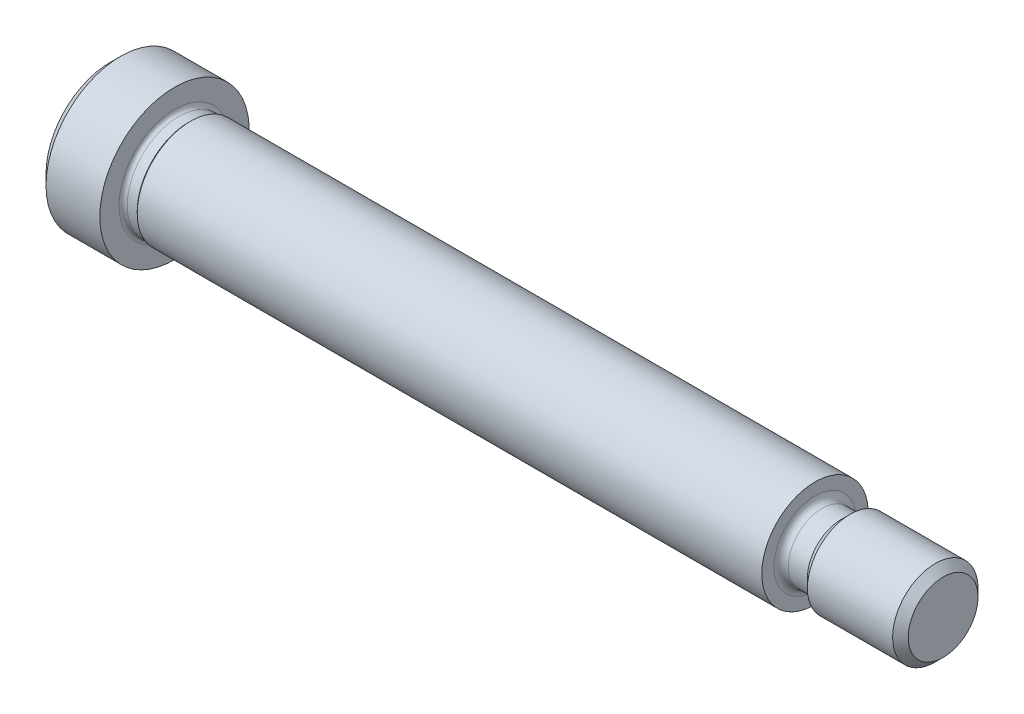
ISO-10303-21;
HEADER;
FILE_DESCRIPTION(('STEP AP214'),'2;1');
FILE_NAME('part.step','',(''),(''),'','','');
FILE_SCHEMA(('AUTOMOTIVE_DESIGN { 1 0 10303 214 1 1 1 1 }'));
ENDSEC;
DATA;
#1=APPLICATION_CONTEXT('core data for automotive mechanical design processes');
#2=APPLICATION_PROTOCOL_DEFINITION('international standard','automotive_design',2000,#1);
#3=PRODUCT_CONTEXT('',#1,'mechanical');
#4=PRODUCT('Part','Part','',(#3));
#5=PRODUCT_RELATED_PRODUCT_CATEGORY('part','',(#4));
#6=PRODUCT_DEFINITION_FORMATION('','',#4);
#7=PRODUCT_DEFINITION_CONTEXT('part definition',#1,'design');
#8=PRODUCT_DEFINITION('design','',#6,#7);
#9=PRODUCT_DEFINITION_SHAPE('','',#8);
#10=(LENGTH_UNIT() NAMED_UNIT(*) SI_UNIT(.MILLI.,.METRE.));
#11=(NAMED_UNIT(*) PLANE_ANGLE_UNIT() SI_UNIT($,.RADIAN.));
#12=(NAMED_UNIT(*) SI_UNIT($,.STERADIAN.) SOLID_ANGLE_UNIT());
#13=UNCERTAINTY_MEASURE_WITH_UNIT(LENGTH_MEASURE(1.E-05),#10,'distance_accuracy_value','');
#14=(GEOMETRIC_REPRESENTATION_CONTEXT(3) GLOBAL_UNCERTAINTY_ASSIGNED_CONTEXT((#13)) GLOBAL_UNIT_ASSIGNED_CONTEXT((#10,
#11,#12)) REPRESENTATION_CONTEXT('',''));
#15=CARTESIAN_POINT('',(0.,0.,0.));
#16=DIRECTION('',(0.,0.,1.));
#17=DIRECTION('',(1.,0.,0.));
#18=AXIS2_PLACEMENT_3D('',#15,#16,#17);
#19=CARTESIAN_POINT('',(0.,0.,0.));
#20=DIRECTION('',(-1.,0.,0.));
#21=DIRECTION('',(0.,0.,1.));
#22=AXIS2_PLACEMENT_3D('',#19,#20,#21);
#23=PLANE('',#22);
#24=CARTESIAN_POINT('',(0.,0.,0.));
#25=DIRECTION('',(-1.,0.,0.));
#26=DIRECTION('',(0.,0.,1.));
#27=AXIS2_PLACEMENT_3D('',#24,#25,#26);
#28=CIRCLE('',#27,9.58849999999999);
#29=CARTESIAN_POINT('',(0.,0.,9.5885));
#30=VERTEX_POINT('',#29);
#31=EDGE_CURVE('E11',#30,#30,#28,.T.);
#32=ORIENTED_EDGE('',*,*,#31,.T.);
#33=EDGE_LOOP('',(#32));
#34=FACE_BOUND('',#33,.T.);
#35=DIRECTION('',(0.,-0.500000000000002,-0.866025403784439));
#36=VECTOR('',#35,1.);
#37=CARTESIAN_POINT('',(0.,-2.28769270663698,3.96240000000001));
#38=LINE('',#37,#36);
#39=CARTESIAN_POINT('',(0.,-2.28769270663698,3.96240000000001));
#40=VERTEX_POINT('',#39);
#41=CARTESIAN_POINT('',(0.,-4.57538541327395,0.));
#42=VERTEX_POINT('',#41);
#43=EDGE_CURVE('E50',#40,#42,#38,.T.);
#44=ORIENTED_EDGE('',*,*,#43,.T.);
#45=DIRECTION('',(0.,0.500000000000002,-0.866025403784439));
#46=VECTOR('',#45,1.);
#47=CARTESIAN_POINT('',(0.,-4.57538541327395,0.));
#48=LINE('',#47,#46);
#49=CARTESIAN_POINT('',(0.,-2.28769270663698,-3.96239999999999));
#50=VERTEX_POINT('',#49);
#51=EDGE_CURVE('E479',#42,#50,#48,.T.);
#52=ORIENTED_EDGE('',*,*,#51,.T.);
#53=DIRECTION('',(0.,1.,0.));
#54=VECTOR('',#53,1.);
#55=CARTESIAN_POINT('',(0.,-2.28769270663698,-3.96239999999999));
#56=LINE('',#55,#54);
#57=CARTESIAN_POINT('',(0.,2.28769270663698,-3.96240000000001));
#58=VERTEX_POINT('',#57);
#59=EDGE_CURVE('E130',#50,#58,#56,.T.);
#60=ORIENTED_EDGE('',*,*,#59,.T.);
#61=DIRECTION('',(0.,0.500000000000002,0.866025403784439));
#62=VECTOR('',#61,1.);
#63=CARTESIAN_POINT('',(0.,2.28769270663698,-3.96240000000001));
#64=LINE('',#63,#62);
#65=CARTESIAN_POINT('',(0.,4.57538541327395,0.));
#66=VERTEX_POINT('',#65);
#67=EDGE_CURVE('E482',#58,#66,#64,.T.);
#68=ORIENTED_EDGE('',*,*,#67,.T.);
#69=DIRECTION('',(0.,-0.500000000000001,0.866025403784439));
#70=VECTOR('',#69,1.);
#71=CARTESIAN_POINT('',(0.,4.57538541327395,0.));
#72=LINE('',#71,#70);
#73=CARTESIAN_POINT('',(0.,2.28769270663697,3.96240000000001));
#74=VERTEX_POINT('',#73);
#75=EDGE_CURVE('E484',#66,#74,#72,.T.);
#76=ORIENTED_EDGE('',*,*,#75,.T.);
#77=DIRECTION('',(0.,-1.,0.));
#78=VECTOR('',#77,1.);
#79=CARTESIAN_POINT('',(0.,2.28769270663697,3.96240000000001));
#80=LINE('',#79,#78);
#81=EDGE_CURVE('E486',#74,#40,#80,.T.);
#82=ORIENTED_EDGE('',*,*,#81,.T.);
#83=EDGE_LOOP('',(#44,#52,#60,#68,#76,#82));
#84=FACE_BOUND('',#83,.T.);
#85=ADVANCED_FACE('F36',(#34,#84),#23,.T.);
#86=CARTESIAN_POINT('',(0.,0.,0.));
#87=DIRECTION('',(1.,0.,0.));
#88=DIRECTION('',(0.,0.,-1.));
#89=AXIS2_PLACEMENT_3D('',#86,#87,#88);
#90=CONICAL_SURFACE('',#89,9.58849999999999,0.785398163397451);
#91=CARTESIAN_POINT('',(1.524,0.,0.));
#92=DIRECTION('',(-1.,0.,0.));
#93=DIRECTION('',(0.,0.,1.));
#94=AXIS2_PLACEMENT_3D('',#91,#92,#93);
#95=CIRCLE('',#94,11.1125);
#96=CARTESIAN_POINT('',(1.524,0.,11.1125));
#97=VERTEX_POINT('',#96);
#98=EDGE_CURVE('E43',#97,#97,#95,.T.);
#99=ORIENTED_EDGE('',*,*,#98,.T.);
#100=EDGE_LOOP('',(#99));
#101=FACE_BOUND('',#100,.T.);
#102=ORIENTED_EDGE('',*,*,#31,.F.);
#103=EDGE_LOOP('',(#102));
#104=FACE_BOUND('',#103,.T.);
#105=ADVANCED_FACE('F182',(#101,#104),#90,.T.);
#106=CARTESIAN_POINT('',(-6.34999999999999,0.,0.));
#107=DIRECTION('',(-1.,0.,0.));
#108=DIRECTION('',(0.,0.,1.));
#109=AXIS2_PLACEMENT_3D('',#106,#107,#108);
#110=CYLINDRICAL_SURFACE('',#109,11.1125);
#111=CARTESIAN_POINT('',(9.52500000000001,0.,0.));
#112=DIRECTION('',(-1.,0.,0.));
#113=DIRECTION('',(0.,0.,1.));
#114=AXIS2_PLACEMENT_3D('',#111,#112,#113);
#115=CIRCLE('',#114,11.1125);
#116=CARTESIAN_POINT('',(9.52500000000001,0.,11.1125));
#117=VERTEX_POINT('',#116);
#118=EDGE_CURVE('E177',#117,#117,#115,.T.);
#119=ORIENTED_EDGE('',*,*,#118,.T.);
#120=EDGE_LOOP('',(#119));
#121=FACE_BOUND('',#120,.T.);
#122=ORIENTED_EDGE('',*,*,#98,.F.);
#123=EDGE_LOOP('',(#122));
#124=FACE_BOUND('',#123,.T.);
#125=ADVANCED_FACE('F185',(#121,#124),#110,.T.);
#126=CARTESIAN_POINT('',(9.52500000000001,11.1125,0.));
#127=DIRECTION('',(1.,0.,0.));
#128=DIRECTION('',(0.,0.,-1.));
#129=AXIS2_PLACEMENT_3D('',#126,#127,#128);
#130=PLANE('',#129);
#131=CARTESIAN_POINT('',(9.52500000000001,0.,0.));
#132=DIRECTION('',(-1.,0.,0.));
#133=DIRECTION('',(0.,0.,1.));
#134=AXIS2_PLACEMENT_3D('',#131,#132,#133);
#135=CIRCLE('',#134,8.255);
#136=CARTESIAN_POINT('',(9.52500000000001,0.,8.25500000000001));
#137=VERTEX_POINT('',#136);
#138=EDGE_CURVE('E174',#137,#137,#135,.T.);
#139=ORIENTED_EDGE('',*,*,#138,.T.);
#140=EDGE_LOOP('',(#139));
#141=FACE_BOUND('',#140,.T.);
#142=ORIENTED_EDGE('',*,*,#118,.F.);
#143=EDGE_LOOP('',(#142));
#144=FACE_BOUND('',#143,.T.);
#145=ADVANCED_FACE('F187',(#141,#144),#130,.T.);
#146=CARTESIAN_POINT('',(10.1346,0.,0.));
#147=DIRECTION('',(-1.,0.,0.));
#148=DIRECTION('',(0.,0.,1.));
#149=AXIS2_PLACEMENT_3D('',#146,#147,#148);
#150=TOROIDAL_SURFACE('',#149,8.255,0.609599999999999);
#151=ORIENTED_EDGE('',*,*,#138,.F.);
#152=EDGE_LOOP('',(#151));
#153=FACE_BOUND('',#152,.T.);
#154=CARTESIAN_POINT('',(10.1346,0.,0.));
#155=DIRECTION('',(-1.,0.,0.));
#156=DIRECTION('',(0.,0.,1.));
#157=AXIS2_PLACEMENT_3D('',#154,#155,#156);
#158=CIRCLE('',#157,7.6454);
#159=CARTESIAN_POINT('',(10.1346,0.,7.64540000000001));
#160=VERTEX_POINT('',#159);
#161=EDGE_CURVE('E171',#160,#160,#158,.T.);
#162=ORIENTED_EDGE('',*,*,#161,.T.);
#163=EDGE_LOOP('',(#162));
#164=FACE_BOUND('',#163,.T.);
#165=ADVANCED_FACE('F194',(#153,#164),#150,.F.);
#166=CARTESIAN_POINT('',(-6.34999999999999,0.,0.));
#167=DIRECTION('',(-1.,0.,0.));
#168=DIRECTION('',(0.,0.,1.));
#169=AXIS2_PLACEMENT_3D('',#166,#167,#168);
#170=CYLINDRICAL_SURFACE('',#169,7.6454);
#171=CARTESIAN_POINT('',(11.6205,0.,0.));
#172=DIRECTION('',(-1.,0.,0.));
#173=DIRECTION('',(0.,0.,1.));
#174=AXIS2_PLACEMENT_3D('',#171,#172,#173);
#175=CIRCLE('',#174,7.6454);
#176=CARTESIAN_POINT('',(11.6205,0.,7.64540000000001));
#177=VERTEX_POINT('',#176);
#178=EDGE_CURVE('E168',#177,#177,#175,.T.);
#179=ORIENTED_EDGE('',*,*,#178,.T.);
#180=EDGE_LOOP('',(#179));
#181=FACE_BOUND('',#180,.T.);
#182=ORIENTED_EDGE('',*,*,#161,.F.);
#183=EDGE_LOOP('',(#182));
#184=FACE_BOUND('',#183,.T.);
#185=ADVANCED_FACE('F225',(#181,#184),#170,.T.);
#186=CARTESIAN_POINT('',(11.6205,0.,0.));
#187=DIRECTION('',(1.,0.,0.));
#188=DIRECTION('',(0.,0.,-1.));
#189=AXIS2_PLACEMENT_3D('',#186,#187,#188);
#190=CONICAL_SURFACE('',#189,7.6454,0.785398163397458);
#191=CARTESIAN_POINT('',(11.8872,0.,0.));
#192=DIRECTION('',(-1.,0.,0.));
#193=DIRECTION('',(0.,0.,1.));
#194=AXIS2_PLACEMENT_3D('',#191,#192,#193);
#195=CIRCLE('',#194,7.9121);
#196=CARTESIAN_POINT('',(11.8872,0.,7.91210000000001));
#197=VERTEX_POINT('',#196);
#198=EDGE_CURVE('E165',#197,#197,#195,.T.);
#199=ORIENTED_EDGE('',*,*,#198,.T.);
#200=EDGE_LOOP('',(#199));
#201=FACE_BOUND('',#200,.T.);
#202=ORIENTED_EDGE('',*,*,#178,.F.);
#203=EDGE_LOOP('',(#202));
#204=FACE_BOUND('',#203,.T.);
#205=ADVANCED_FACE('F235',(#201,#204),#190,.T.);
#206=CARTESIAN_POINT('',(-6.34999999999999,0.,0.));
#207=DIRECTION('',(-1.,0.,0.));
#208=DIRECTION('',(0.,0.,1.));
#209=AXIS2_PLACEMENT_3D('',#206,#207,#208);
#210=CYLINDRICAL_SURFACE('',#209,7.9121);
#211=CARTESIAN_POINT('',(104.775,0.,0.));
#212=DIRECTION('',(-1.,0.,0.));
#213=DIRECTION('',(0.,0.,1.));
#214=AXIS2_PLACEMENT_3D('',#211,#212,#213);
#215=CIRCLE('',#214,7.9121);
#216=CARTESIAN_POINT('',(104.775,0.,7.91210000000001));
#217=VERTEX_POINT('',#216);
#218=EDGE_CURVE('E162',#217,#217,#215,.T.);
#219=ORIENTED_EDGE('',*,*,#218,.T.);
#220=EDGE_LOOP('',(#219));
#221=FACE_BOUND('',#220,.T.);
#222=ORIENTED_EDGE('',*,*,#198,.F.);
#223=EDGE_LOOP('',(#222));
#224=FACE_BOUND('',#223,.T.);
#225=ADVANCED_FACE('F245',(#221,#224),#210,.T.);
#226=CARTESIAN_POINT('',(104.775,7.91209999999999,0.));
#227=DIRECTION('',(1.,0.,0.));
#228=DIRECTION('',(0.,0.,-1.));
#229=AXIS2_PLACEMENT_3D('',#226,#227,#228);
#230=PLANE('',#229);
#231=CARTESIAN_POINT('',(104.775,0.,0.));
#232=DIRECTION('',(-1.,0.,0.));
#233=DIRECTION('',(0.,0.,1.));
#234=AXIS2_PLACEMENT_3D('',#231,#232,#233);
#235=CIRCLE('',#234,6.1087);
#236=CARTESIAN_POINT('',(104.775,0.,6.10870000000001));
#237=VERTEX_POINT('',#236);
#238=EDGE_CURVE('E159',#237,#237,#235,.T.);
#239=ORIENTED_EDGE('',*,*,#238,.T.);
#240=EDGE_LOOP('',(#239));
#241=FACE_BOUND('',#240,.T.);
#242=ORIENTED_EDGE('',*,*,#218,.F.);
#243=EDGE_LOOP('',(#242));
#244=FACE_BOUND('',#243,.T.);
#245=ADVANCED_FACE('F255',(#241,#244),#230,.T.);
#246=CARTESIAN_POINT('',(105.8418,0.,0.));
#247=DIRECTION('',(-1.,0.,0.));
#248=DIRECTION('',(0.,0.,1.));
#249=AXIS2_PLACEMENT_3D('',#246,#247,#248);
#250=TOROIDAL_SURFACE('',#249,6.1087,1.06680000000001);
#251=CARTESIAN_POINT('',(105.8418,0.,0.));
#252=DIRECTION('',(-1.,0.,0.));
#253=DIRECTION('',(0.,0.,1.));
#254=AXIS2_PLACEMENT_3D('',#251,#252,#253);
#255=CIRCLE('',#254,5.04189999999999);
#256=CARTESIAN_POINT('',(105.8418,0.,5.04189999999999));
#257=VERTEX_POINT('',#256);
#258=EDGE_CURVE('E156',#257,#257,#255,.T.);
#259=ORIENTED_EDGE('',*,*,#258,.T.);
#260=EDGE_LOOP('',(#259));
#261=FACE_BOUND('',#260,.T.);
#262=ORIENTED_EDGE('',*,*,#238,.F.);
#263=EDGE_LOOP('',(#262));
#264=FACE_BOUND('',#263,.T.);
#265=ADVANCED_FACE('F265',(#261,#264),#250,.F.);
#266=CARTESIAN_POINT('',(-6.34999999999999,0.,0.));
#267=DIRECTION('',(-1.,0.,0.));
#268=DIRECTION('',(0.,0.,1.));
#269=AXIS2_PLACEMENT_3D('',#266,#267,#268);
#270=CYLINDRICAL_SURFACE('',#269,5.04189999999999);
#271=CARTESIAN_POINT('',(108.6866,0.,0.));
#272=DIRECTION('',(-1.,0.,0.));
#273=DIRECTION('',(0.,0.,1.));
#274=AXIS2_PLACEMENT_3D('',#271,#272,#273);
#275=CIRCLE('',#274,5.0419);
#276=CARTESIAN_POINT('',(108.6866,0.,5.0419));
#277=VERTEX_POINT('',#276);
#278=EDGE_CURVE('E153',#277,#277,#275,.T.);
#279=ORIENTED_EDGE('',*,*,#278,.T.);
#280=EDGE_LOOP('',(#279));
#281=FACE_BOUND('',#280,.T.);
#282=ORIENTED_EDGE('',*,*,#258,.F.);
#283=EDGE_LOOP('',(#282));
#284=FACE_BOUND('',#283,.T.);
#285=ADVANCED_FACE('F275',(#281,#284),#270,.T.);
#286=CARTESIAN_POINT('',(108.6866,0.,0.));
#287=DIRECTION('',(1.,0.,0.));
#288=DIRECTION('',(0.,0.,-1.));
#289=AXIS2_PLACEMENT_3D('',#286,#287,#288);
#290=CONICAL_SURFACE('',#289,5.0419,0.785398163397451);
#291=CARTESIAN_POINT('',(109.9947,0.,0.));
#292=DIRECTION('',(-1.,0.,0.));
#293=DIRECTION('',(0.,0.,1.));
#294=AXIS2_PLACEMENT_3D('',#291,#292,#293);
#295=CIRCLE('',#294,6.35);
#296=CARTESIAN_POINT('',(109.9947,0.,6.35000000000001));
#297=VERTEX_POINT('',#296);
#298=EDGE_CURVE('E150',#297,#297,#295,.T.);
#299=ORIENTED_EDGE('',*,*,#298,.T.);
#300=EDGE_LOOP('',(#299));
#301=FACE_BOUND('',#300,.T.);
#302=ORIENTED_EDGE('',*,*,#278,.F.);
#303=EDGE_LOOP('',(#302));
#304=FACE_BOUND('',#303,.T.);
#305=ADVANCED_FACE('F285',(#301,#304),#290,.T.);
#306=CARTESIAN_POINT('',(-6.34999999999999,0.,0.));
#307=DIRECTION('',(-1.,0.,0.));
#308=DIRECTION('',(0.,0.,1.));
#309=AXIS2_PLACEMENT_3D('',#306,#307,#308);
#310=CYLINDRICAL_SURFACE('',#309,6.35);
#311=CARTESIAN_POINT('',(122.66168,0.,0.));
#312=DIRECTION('',(-1.,0.,0.));
#313=DIRECTION('',(0.,0.,1.));
#314=AXIS2_PLACEMENT_3D('',#311,#312,#313);
#315=CIRCLE('',#314,6.35);
#316=CARTESIAN_POINT('',(122.66168,0.,6.35000000000001));
#317=VERTEX_POINT('',#316);
#318=EDGE_CURVE('E147',#317,#317,#315,.T.);
#319=ORIENTED_EDGE('',*,*,#318,.T.);
#320=EDGE_LOOP('',(#319));
#321=FACE_BOUND('',#320,.T.);
#322=ORIENTED_EDGE('',*,*,#298,.F.);
#323=EDGE_LOOP('',(#322));
#324=FACE_BOUND('',#323,.T.);
#325=ADVANCED_FACE('F295',(#321,#324),#310,.T.);
#326=CARTESIAN_POINT('',(122.66168,0.,0.));
#327=DIRECTION('',(-1.,0.,0.));
#328=DIRECTION('',(0.,0.,1.));
#329=AXIS2_PLACEMENT_3D('',#326,#327,#328);
#330=CONICAL_SURFACE('',#329,6.35,0.785398163397474);
#331=CARTESIAN_POINT('',(123.825,0.,0.));
#332=DIRECTION('',(-1.,0.,0.));
#333=DIRECTION('',(0.,0.,1.));
#334=AXIS2_PLACEMENT_3D('',#331,#332,#333);
#335=CIRCLE('',#334,5.18668);
#336=CARTESIAN_POINT('',(123.825,0.,5.18668));
#337=VERTEX_POINT('',#336);
#338=EDGE_CURVE('E143',#337,#337,#335,.T.);
#339=ORIENTED_EDGE('',*,*,#338,.T.);
#340=EDGE_LOOP('',(#339));
#341=FACE_BOUND('',#340,.T.);
#342=ORIENTED_EDGE('',*,*,#318,.F.);
#343=EDGE_LOOP('',(#342));
#344=FACE_BOUND('',#343,.T.);
#345=ADVANCED_FACE('F305',(#341,#344),#330,.T.);
#346=CARTESIAN_POINT('',(123.825,5.18668000000001,0.));
#347=DIRECTION('',(1.,0.,0.));
#348=DIRECTION('',(0.,0.,-1.));
#349=AXIS2_PLACEMENT_3D('',#346,#347,#348);
#350=PLANE('',#349);
#351=ORIENTED_EDGE('',*,*,#338,.F.);
#352=EDGE_LOOP('',(#351));
#353=FACE_BOUND('',#352,.T.);
#354=ADVANCED_FACE('F315',(#353),#350,.T.);
#355=CARTESIAN_POINT('',(5.94359999999999,-4.57538541327395,0.));
#356=DIRECTION('',(0.,0.866025403784439,0.500000000000001));
#357=DIRECTION('',(0.,-0.500000000000001,0.866025403784439));
#358=AXIS2_PLACEMENT_3D('',#355,#356,#357);
#359=PLANE('',#358);
#360=DIRECTION('',(0.,0.500000000000002,-0.866025403784439));
#361=VECTOR('',#360,1.);
#362=CARTESIAN_POINT('',(5.94359999999999,-4.57538541327395,0.));
#363=LINE('',#362,#361);
#364=CARTESIAN_POINT('',(5.94359999999999,-4.57538541327395,0.));
#365=VERTEX_POINT('',#364);
#366=CARTESIAN_POINT('',(5.94359999999999,-3.43153905995548,-1.9812));
#367=VERTEX_POINT('',#366);
#368=EDGE_CURVE('E58',#365,#367,#363,.T.);
#369=ORIENTED_EDGE('',*,*,#368,.T.);
#370=CARTESIAN_POINT('',(5.94359999999999,-2.28769270663698,-3.96239999999999));
#371=VERTEX_POINT('',#370);
#372=EDGE_CURVE('E108',#367,#371,#363,.T.);
#373=ORIENTED_EDGE('',*,*,#372,.T.);
#374=DIRECTION('',(-1.,0.,0.));
#375=VECTOR('',#374,1.);
#376=CARTESIAN_POINT('',(5.94359999999999,-2.28769270663698,-3.96239999999999));
#377=LINE('',#376,#375);
#378=EDGE_CURVE('E112',#371,#50,#377,.T.);
#379=ORIENTED_EDGE('',*,*,#378,.T.);
#380=ORIENTED_EDGE('',*,*,#51,.F.);
#381=DIRECTION('',(-1.,0.,0.));
#382=VECTOR('',#381,1.);
#383=CARTESIAN_POINT('',(5.94359999999999,-4.57538541327395,0.));
#384=LINE('',#383,#382);
#385=EDGE_CURVE('E478',#365,#42,#384,.T.);
#386=ORIENTED_EDGE('',*,*,#385,.F.);
#387=EDGE_LOOP('',(#369,#373,#379,#380,#386));
#388=FACE_BOUND('',#387,.T.);
#389=ADVANCED_FACE('F110',(#388),#359,.T.);
#390=CARTESIAN_POINT('',(5.94359999999999,-2.28769270663698,-3.96239999999999));
#391=DIRECTION('',(0.,0.,1.));
#392=DIRECTION('',(1.,0.,0.));
#393=AXIS2_PLACEMENT_3D('',#390,#391,#392);
#394=PLANE('',#393);
#395=DIRECTION('',(0.,1.,0.));
#396=VECTOR('',#395,1.);
#397=CARTESIAN_POINT('',(5.94359999999999,-2.28769270663698,-3.96239999999999));
#398=LINE('',#397,#396);
#399=CARTESIAN_POINT('',(5.94359999999999,0.,-3.96239999999999));
#400=VERTEX_POINT('',#399);
#401=EDGE_CURVE('E117',#371,#400,#398,.T.);
#402=ORIENTED_EDGE('',*,*,#401,.T.);
#403=CARTESIAN_POINT('',(5.94359999999999,2.28769270663698,-3.96240000000001));
#404=VERTEX_POINT('',#403);
#405=EDGE_CURVE('E125',#400,#404,#398,.T.);
#406=ORIENTED_EDGE('',*,*,#405,.T.);
#407=DIRECTION('',(-1.,0.,0.));
#408=VECTOR('',#407,1.);
#409=CARTESIAN_POINT('',(5.94359999999999,2.28769270663698,-3.96240000000001));
#410=LINE('',#409,#408);
#411=EDGE_CURVE('E132',#404,#58,#410,.T.);
#412=ORIENTED_EDGE('',*,*,#411,.T.);
#413=ORIENTED_EDGE('',*,*,#59,.F.);
#414=ORIENTED_EDGE('',*,*,#378,.F.);
#415=EDGE_LOOP('',(#402,#406,#412,#413,#414));
#416=FACE_BOUND('',#415,.T.);
#417=ADVANCED_FACE('F128',(#416),#394,.T.);
#418=CARTESIAN_POINT('',(5.94359999999999,2.28769270663698,-3.96240000000001));
#419=DIRECTION('',(0.,-0.866025403784439,0.500000000000002));
#420=DIRECTION('',(0.,-0.500000000000002,-0.866025403784439));
#421=AXIS2_PLACEMENT_3D('',#418,#419,#420);
#422=PLANE('',#421);
#423=DIRECTION('',(0.,0.500000000000002,0.866025403784439));
#424=VECTOR('',#423,1.);
#425=CARTESIAN_POINT('',(5.94359999999999,2.28769270663698,-3.96240000000001));
#426=LINE('',#425,#424);
#427=CARTESIAN_POINT('',(5.94359999999999,3.43153905995545,-1.9812));
#428=VERTEX_POINT('',#427);
#429=EDGE_CURVE('E502',#404,#428,#426,.T.);
#430=ORIENTED_EDGE('',*,*,#429,.T.);
#431=CARTESIAN_POINT('',(5.94359999999999,4.57538541327395,0.));
#432=VERTEX_POINT('',#431);
#433=EDGE_CURVE('E124',#428,#432,#426,.T.);
#434=ORIENTED_EDGE('',*,*,#433,.T.);
#435=DIRECTION('',(-1.,0.,0.));
#436=VECTOR('',#435,1.);
#437=CARTESIAN_POINT('',(5.94359999999999,4.57538541327395,0.));
#438=LINE('',#437,#436);
#439=EDGE_CURVE('E138',#432,#66,#438,.T.);
#440=ORIENTED_EDGE('',*,*,#439,.T.);
#441=ORIENTED_EDGE('',*,*,#67,.F.);
#442=ORIENTED_EDGE('',*,*,#411,.F.);
#443=EDGE_LOOP('',(#430,#434,#440,#441,#442));
#444=FACE_BOUND('',#443,.T.);
#445=ADVANCED_FACE('F343',(#444),#422,.T.);
#446=CARTESIAN_POINT('',(5.94359999999999,4.57538541327395,0.));
#447=DIRECTION('',(0.,-0.866025403784439,-0.500000000000001));
#448=DIRECTION('',(0.,0.500000000000001,-0.866025403784439));
#449=AXIS2_PLACEMENT_3D('',#446,#447,#448);
#450=PLANE('',#449);
#451=DIRECTION('',(0.,-0.500000000000001,0.866025403784439));
#452=VECTOR('',#451,1.);
#453=CARTESIAN_POINT('',(5.94359999999999,4.57538541327395,0.));
#454=LINE('',#453,#452);
#455=CARTESIAN_POINT('',(5.94359999999999,3.43153905995546,1.98119999999999));
#456=VERTEX_POINT('',#455);
#457=EDGE_CURVE('E467',#432,#456,#454,.T.);
#458=ORIENTED_EDGE('',*,*,#457,.T.);
#459=CARTESIAN_POINT('',(5.94359999999999,2.28769270663697,3.96240000000001));
#460=VERTEX_POINT('',#459);
#461=EDGE_CURVE('E458',#456,#460,#454,.T.);
#462=ORIENTED_EDGE('',*,*,#461,.T.);
#463=DIRECTION('',(-1.,0.,0.));
#464=VECTOR('',#463,1.);
#465=CARTESIAN_POINT('',(5.94359999999999,2.28769270663697,3.96240000000001));
#466=LINE('',#465,#464);
#467=EDGE_CURVE('E472',#460,#74,#466,.T.);
#468=ORIENTED_EDGE('',*,*,#467,.T.);
#469=ORIENTED_EDGE('',*,*,#75,.F.);
#470=ORIENTED_EDGE('',*,*,#439,.F.);
#471=EDGE_LOOP('',(#458,#462,#468,#469,#470));
#472=FACE_BOUND('',#471,.T.);
#473=ADVANCED_FACE('F352',(#472),#450,.T.);
#474=CARTESIAN_POINT('',(5.94359999999999,2.28769270663697,3.96240000000001));
#475=DIRECTION('',(0.,0.,-1.));
#476=DIRECTION('',(-1.,0.,0.));
#477=AXIS2_PLACEMENT_3D('',#474,#475,#476);
#478=PLANE('',#477);
#479=DIRECTION('',(0.,-1.,0.));
#480=VECTOR('',#479,1.);
#481=CARTESIAN_POINT('',(5.94359999999999,2.28769270663697,3.96240000000001));
#482=LINE('',#481,#480);
#483=CARTESIAN_POINT('',(5.94359999999999,0.,3.96240000000003));
#484=VERTEX_POINT('',#483);
#485=EDGE_CURVE('E457',#460,#484,#482,.T.);
#486=ORIENTED_EDGE('',*,*,#485,.T.);
#487=CARTESIAN_POINT('',(5.94359999999999,-2.28769270663698,3.96240000000001));
#488=VERTEX_POINT('',#487);
#489=EDGE_CURVE('E461',#484,#488,#482,.T.);
#490=ORIENTED_EDGE('',*,*,#489,.T.);
#491=DIRECTION('',(-1.,0.,0.));
#492=VECTOR('',#491,1.);
#493=CARTESIAN_POINT('',(5.94359999999999,-2.28769270663698,3.96240000000001));
#494=LINE('',#493,#492);
#495=EDGE_CURVE('E491',#488,#40,#494,.T.);
#496=ORIENTED_EDGE('',*,*,#495,.T.);
#497=ORIENTED_EDGE('',*,*,#81,.F.);
#498=ORIENTED_EDGE('',*,*,#467,.F.);
#499=EDGE_LOOP('',(#486,#490,#496,#497,#498));
#500=FACE_BOUND('',#499,.T.);
#501=ADVANCED_FACE('F362',(#500),#478,.T.);
#502=CARTESIAN_POINT('',(5.94359999999999,-2.28769270663698,3.96240000000001));
#503=DIRECTION('',(0.,0.866025403784439,-0.500000000000002));
#504=DIRECTION('',(0.,0.500000000000002,0.866025403784439));
#505=AXIS2_PLACEMENT_3D('',#502,#503,#504);
#506=PLANE('',#505);
#507=DIRECTION('',(0.,-0.500000000000002,-0.866025403784439));
#508=VECTOR('',#507,1.);
#509=CARTESIAN_POINT('',(5.94359999999999,-2.28769270663698,3.96240000000001));
#510=LINE('',#509,#508);
#511=CARTESIAN_POINT('',(5.94359999999999,-3.43153905995547,1.98119999999999));
#512=VERTEX_POINT('',#511);
#513=EDGE_CURVE('E464',#488,#512,#510,.T.);
#514=ORIENTED_EDGE('',*,*,#513,.T.);
#515=EDGE_CURVE('E473',#512,#365,#510,.T.);
#516=ORIENTED_EDGE('',*,*,#515,.T.);
#517=ORIENTED_EDGE('',*,*,#385,.T.);
#518=ORIENTED_EDGE('',*,*,#43,.F.);
#519=ORIENTED_EDGE('',*,*,#495,.F.);
#520=EDGE_LOOP('',(#514,#516,#517,#518,#519));
#521=FACE_BOUND('',#520,.T.);
#522=ADVANCED_FACE('F372',(#521),#506,.T.);
#523=CARTESIAN_POINT('',(5.94359999999999,0.,-7.9248));
#524=DIRECTION('',(1.,0.,0.));
#525=DIRECTION('',(0.,0.,-1.));
#526=AXIS2_PLACEMENT_3D('',#523,#524,#525);
#527=PLANE('',#526);
#528=CARTESIAN_POINT('',(5.94359999999999,0.,0.));
#529=DIRECTION('',(-1.,0.,0.));
#530=DIRECTION('',(0.,0.,1.));
#531=AXIS2_PLACEMENT_3D('',#528,#529,#530);
#532=CIRCLE('',#531,3.9624);
#533=EDGE_CURVE('E503',#428,#400,#532,.T.);
#534=ORIENTED_EDGE('',*,*,#533,.F.);
#535=ORIENTED_EDGE('',*,*,#429,.F.);
#536=ORIENTED_EDGE('',*,*,#405,.F.);
#537=EDGE_LOOP('',(#534,#535,#536));
#538=FACE_BOUND('',#537,.T.);
#539=ADVANCED_FACE('F382',(#538),#527,.F.);
#540=EDGE_CURVE('E144',#456,#428,#532,.T.);
#541=ORIENTED_EDGE('',*,*,#540,.F.);
#542=ORIENTED_EDGE('',*,*,#457,.F.);
#543=ORIENTED_EDGE('',*,*,#433,.F.);
#544=EDGE_LOOP('',(#541,#542,#543));
#545=FACE_BOUND('',#544,.T.);
#546=ADVANCED_FACE('F392',(#545),#527,.F.);
#547=EDGE_CURVE('E137',#484,#456,#532,.T.);
#548=ORIENTED_EDGE('',*,*,#547,.F.);
#549=ORIENTED_EDGE('',*,*,#485,.F.);
#550=ORIENTED_EDGE('',*,*,#461,.F.);
#551=EDGE_LOOP('',(#548,#549,#550));
#552=FACE_BOUND('',#551,.T.);
#553=ADVANCED_FACE('F402',(#552),#527,.F.);
#554=EDGE_CURVE('E131',#512,#484,#532,.T.);
#555=ORIENTED_EDGE('',*,*,#554,.F.);
#556=ORIENTED_EDGE('',*,*,#513,.F.);
#557=ORIENTED_EDGE('',*,*,#489,.F.);
#558=EDGE_LOOP('',(#555,#556,#557));
#559=FACE_BOUND('',#558,.T.);
#560=ADVANCED_FACE('F411',(#559),#527,.F.);
#561=EDGE_CURVE('E135',#367,#512,#532,.T.);
#562=ORIENTED_EDGE('',*,*,#561,.F.);
#563=ORIENTED_EDGE('',*,*,#368,.F.);
#564=ORIENTED_EDGE('',*,*,#515,.F.);
#565=EDGE_LOOP('',(#562,#563,#564));
#566=FACE_BOUND('',#565,.T.);
#567=ADVANCED_FACE('F420',(#566),#527,.F.);
#568=EDGE_CURVE('E120',#400,#367,#532,.T.);
#569=ORIENTED_EDGE('',*,*,#568,.F.);
#570=ORIENTED_EDGE('',*,*,#401,.F.);
#571=ORIENTED_EDGE('',*,*,#372,.F.);
#572=EDGE_LOOP('',(#569,#570,#571));
#573=FACE_BOUND('',#572,.T.);
#574=ADVANCED_FACE('F118',(#573),#527,.F.);
#575=CARTESIAN_POINT('',(8.231292706637,0.,0.));
#576=DIRECTION('',(-1.,0.,0.));
#577=DIRECTION('',(0.,0.,1.));
#578=AXIS2_PLACEMENT_3D('',#575,#576,#577);
#579=CONICAL_SURFACE('',#578,0.,1.04719755119659);
#580=ORIENTED_EDGE('',*,*,#547,.T.);
#581=ORIENTED_EDGE('',*,*,#540,.T.);
#582=ORIENTED_EDGE('',*,*,#533,.T.);
#583=ORIENTED_EDGE('',*,*,#568,.T.);
#584=ORIENTED_EDGE('',*,*,#561,.T.);
#585=ORIENTED_EDGE('',*,*,#554,.T.);
#586=EDGE_LOOP('',(#580,#581,#582,#583,#584,#585));
#587=FACE_BOUND('',#586,.T.);
#588=CARTESIAN_POINT('',(8.231292706637,0.,0.));
#589=VERTEX_POINT('',#588);
#590=VERTEX_LOOP('',#589);
#591=FACE_BOUND('',#590,.T.);
#592=ADVANCED_FACE('F437',(#587,#591),#579,.F.);
#593=CLOSED_SHELL('',(#85,#105,#125,#145,#165,#185,#205,#225,#245,#265,#285,#305,#325,#345,#354,
#389,#417,#445,#473,#501,#522,#539,#546,#553,#560,#567,#574,#592));
#594=MANIFOLD_SOLID_BREP('B2',#593);
#595=ADVANCED_BREP_SHAPE_REPRESENTATION('',(#18,#594),#14);
#596=SHAPE_DEFINITION_REPRESENTATION(#9,#595);
ENDSEC;
END-ISO-10303-21;
